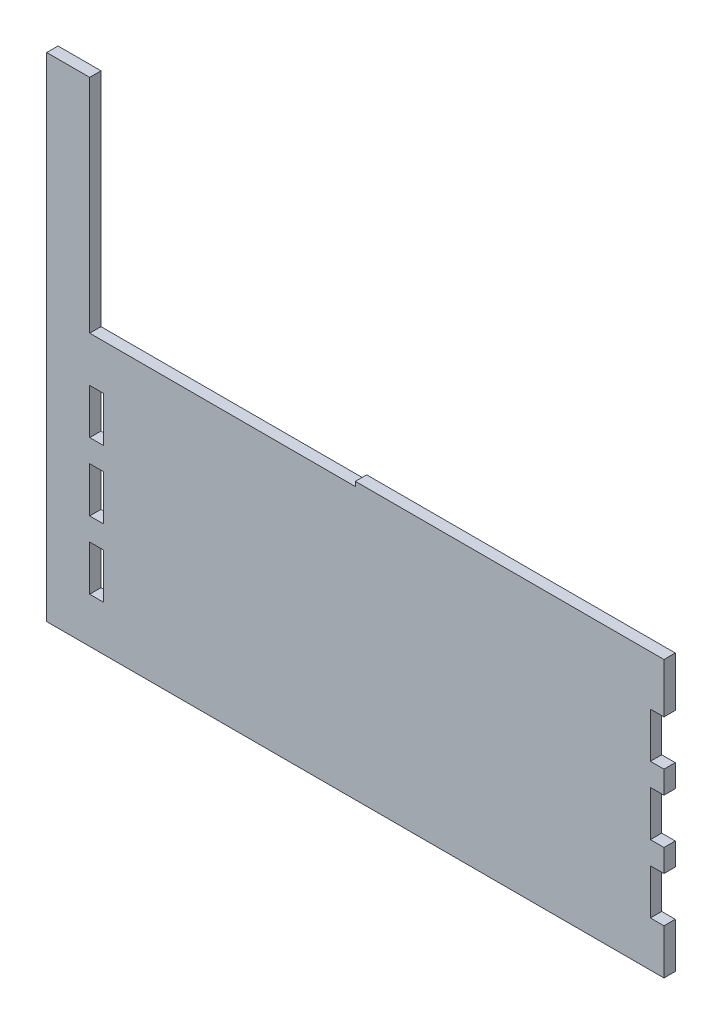
ISO-10303-21;
HEADER;
FILE_DESCRIPTION(('STEP AP214'),'2;1');
FILE_NAME('part.step','',(''),(''),'','','');
FILE_SCHEMA(('AUTOMOTIVE_DESIGN { 1 0 10303 214 1 1 1 1 }'));
ENDSEC;
DATA;
#1=APPLICATION_CONTEXT('core data for automotive mechanical design processes');
#2=APPLICATION_PROTOCOL_DEFINITION('international standard','automotive_design',2000,#1);
#3=PRODUCT_CONTEXT('',#1,'mechanical');
#4=PRODUCT('Part','Part','',(#3));
#5=PRODUCT_RELATED_PRODUCT_CATEGORY('part','',(#4));
#6=PRODUCT_DEFINITION_FORMATION('','',#4);
#7=PRODUCT_DEFINITION_CONTEXT('part definition',#1,'design');
#8=PRODUCT_DEFINITION('design','',#6,#7);
#9=PRODUCT_DEFINITION_SHAPE('','',#8);
#10=(LENGTH_UNIT() NAMED_UNIT(*) SI_UNIT(.MILLI.,.METRE.));
#11=(NAMED_UNIT(*) PLANE_ANGLE_UNIT() SI_UNIT($,.RADIAN.));
#12=(NAMED_UNIT(*) SI_UNIT($,.STERADIAN.) SOLID_ANGLE_UNIT());
#13=UNCERTAINTY_MEASURE_WITH_UNIT(LENGTH_MEASURE(1.E-05),#10,'distance_accuracy_value','');
#14=(GEOMETRIC_REPRESENTATION_CONTEXT(3) GLOBAL_UNCERTAINTY_ASSIGNED_CONTEXT((#13)) GLOBAL_UNIT_ASSIGNED_CONTEXT((#10,
#11,#12)) REPRESENTATION_CONTEXT('',''));
#15=CARTESIAN_POINT('',(0.,0.,0.));
#16=DIRECTION('',(0.,0.,1.));
#17=DIRECTION('',(1.,0.,0.));
#18=AXIS2_PLACEMENT_3D('',#15,#16,#17);
#19=CARTESIAN_POINT('',(0.,0.,5.));
#20=DIRECTION('',(0.,0.,-1.));
#21=DIRECTION('',(-1.,0.,0.));
#22=AXIS2_PLACEMENT_3D('',#19,#20,#21);
#23=PLANE('',#22);
#24=DIRECTION('',(0.,-1.,0.));
#25=VECTOR('',#24,1.);
#26=CARTESIAN_POINT('',(-111.5,0.,5.));
#27=LINE('',#26,#25);
#28=CARTESIAN_POINT('',(-111.5,39.,5.));
#29=VERTEX_POINT('',#28);
#30=CARTESIAN_POINT('',(-111.5,19.,5.));
#31=VERTEX_POINT('',#30);
#32=EDGE_CURVE('E405',#29,#31,#27,.T.);
#33=ORIENTED_EDGE('',*,*,#32,.T.);
#34=DIRECTION('',(1.,0.,0.));
#35=VECTOR('',#34,1.);
#36=CARTESIAN_POINT('',(0.,19.,5.));
#37=LINE('',#36,#35);
#38=CARTESIAN_POINT('',(-117.5,19.,5.));
#39=VERTEX_POINT('',#38);
#40=EDGE_CURVE('E511',#39,#31,#37,.T.);
#41=ORIENTED_EDGE('',*,*,#40,.F.);
#42=DIRECTION('',(0.,-1.,0.));
#43=VECTOR('',#42,1.);
#44=CARTESIAN_POINT('',(-117.5,0.,5.));
#45=LINE('',#44,#43);
#46=CARTESIAN_POINT('',(-117.5,39.,5.));
#47=VERTEX_POINT('',#46);
#48=EDGE_CURVE('E507',#47,#39,#45,.T.);
#49=ORIENTED_EDGE('',*,*,#48,.F.);
#50=DIRECTION('',(1.,0.,0.));
#51=VECTOR('',#50,1.);
#52=CARTESIAN_POINT('',(0.,39.,5.));
#53=LINE('',#52,#51);
#54=EDGE_CURVE('E503',#47,#29,#53,.T.);
#55=ORIENTED_EDGE('',*,*,#54,.T.);
#56=EDGE_LOOP('',(#33,#41,#49,#55));
#57=FACE_BOUND('',#56,.T.);
#58=DIRECTION('',(0.,1.,0.));
#59=VECTOR('',#58,1.);
#60=CARTESIAN_POINT('',(-111.5,0.,5.));
#61=LINE('',#60,#59);
#62=CARTESIAN_POINT('',(-111.5,-41.,5.));
#63=VERTEX_POINT('',#62);
#64=CARTESIAN_POINT('',(-111.5,-21.,5.));
#65=VERTEX_POINT('',#64);
#66=EDGE_CURVE('E428',#63,#65,#61,.T.);
#67=ORIENTED_EDGE('',*,*,#66,.F.);
#68=DIRECTION('',(1.,0.,0.));
#69=VECTOR('',#68,1.);
#70=CARTESIAN_POINT('',(0.,-41.,5.));
#71=LINE('',#70,#69);
#72=CARTESIAN_POINT('',(-117.5,-41.,5.));
#73=VERTEX_POINT('',#72);
#74=EDGE_CURVE('E62',#73,#63,#71,.T.);
#75=ORIENTED_EDGE('',*,*,#74,.F.);
#76=DIRECTION('',(0.,-1.,0.));
#77=VECTOR('',#76,1.);
#78=CARTESIAN_POINT('',(-117.5,0.,5.));
#79=LINE('',#78,#77);
#80=CARTESIAN_POINT('',(-117.5,-21.,5.));
#81=VERTEX_POINT('',#80);
#82=EDGE_CURVE('E437',#81,#73,#79,.T.);
#83=ORIENTED_EDGE('',*,*,#82,.F.);
#84=DIRECTION('',(1.,0.,0.));
#85=VECTOR('',#84,1.);
#86=CARTESIAN_POINT('',(0.,-21.,5.));
#87=LINE('',#86,#85);
#88=EDGE_CURVE('E433',#81,#65,#87,.T.);
#89=ORIENTED_EDGE('',*,*,#88,.T.);
#90=EDGE_LOOP('',(#67,#75,#83,#89));
#91=FACE_BOUND('',#90,.T.);
#92=DIRECTION('',(0.,1.,0.));
#93=VECTOR('',#92,1.);
#94=CARTESIAN_POINT('',(-111.5,0.,5.));
#95=LINE('',#94,#93);
#96=CARTESIAN_POINT('',(-111.5,-11.,5.));
#97=VERTEX_POINT('',#96);
#98=CARTESIAN_POINT('',(-111.5,9.,5.));
#99=VERTEX_POINT('',#98);
#100=EDGE_CURVE('E589',#97,#99,#95,.T.);
#101=ORIENTED_EDGE('',*,*,#100,.F.);
#102=DIRECTION('',(1.,0.,0.));
#103=VECTOR('',#102,1.);
#104=CARTESIAN_POINT('',(0.,-11.,5.));
#105=LINE('',#104,#103);
#106=CARTESIAN_POINT('',(-117.5,-11.,5.));
#107=VERTEX_POINT('',#106);
#108=EDGE_CURVE('E54',#107,#97,#105,.T.);
#109=ORIENTED_EDGE('',*,*,#108,.F.);
#110=DIRECTION('',(0.,-1.,0.));
#111=VECTOR('',#110,1.);
#112=CARTESIAN_POINT('',(-117.5,0.,5.));
#113=LINE('',#112,#111);
#114=CARTESIAN_POINT('',(-117.5,9.,5.));
#115=VERTEX_POINT('',#114);
#116=EDGE_CURVE('E403',#115,#107,#113,.T.);
#117=ORIENTED_EDGE('',*,*,#116,.F.);
#118=DIRECTION('',(1.,0.,0.));
#119=VECTOR('',#118,1.);
#120=CARTESIAN_POINT('',(0.,8.99999999999996,5.));
#121=LINE('',#120,#119);
#122=EDGE_CURVE('E417',#115,#99,#121,.T.);
#123=ORIENTED_EDGE('',*,*,#122,.T.);
#124=EDGE_LOOP('',(#101,#109,#117,#123));
#125=FACE_BOUND('',#124,.T.);
#126=DIRECTION('',(0.,-1.,0.));
#127=VECTOR('',#126,1.);
#128=CARTESIAN_POINT('',(0.,0.,5.));
#129=LINE('',#128,#127);
#130=CARTESIAN_POINT('',(0.,61.,5.));
#131=VERTEX_POINT('',#130);
#132=CARTESIAN_POINT('',(0.,59.,5.));
#133=VERTEX_POINT('',#132);
#134=EDGE_CURVE('E249',#131,#133,#129,.T.);
#135=ORIENTED_EDGE('',*,*,#134,.T.);
#136=DIRECTION('',(1.,0.,0.));
#137=VECTOR('',#136,1.);
#138=CARTESIAN_POINT('',(0.,59.,5.));
#139=LINE('',#138,#137);
#140=CARTESIAN_POINT('',(-117.5,59.,5.));
#141=VERTEX_POINT('',#140);
#142=EDGE_CURVE('E261',#141,#133,#139,.T.);
#143=ORIENTED_EDGE('',*,*,#142,.F.);
#144=DIRECTION('',(0.,1.,0.));
#145=VECTOR('',#144,1.);
#146=CARTESIAN_POINT('',(-117.5,61.,5.));
#147=LINE('',#146,#145);
#148=CARTESIAN_POINT('',(-117.5,157.,5.));
#149=VERTEX_POINT('',#148);
#150=EDGE_CURVE('E519',#141,#149,#147,.T.);
#151=ORIENTED_EDGE('',*,*,#150,.T.);
#152=DIRECTION('',(-1.,0.,0.));
#153=VECTOR('',#152,1.);
#154=CARTESIAN_POINT('',(-136.5,157.,5.));
#155=LINE('',#154,#153);
#156=CARTESIAN_POINT('',(-136.5,157.,5.));
#157=VERTEX_POINT('',#156);
#158=EDGE_CURVE('E534',#149,#157,#155,.T.);
#159=ORIENTED_EDGE('',*,*,#158,.T.);
#160=DIRECTION('',(0.,-1.,0.));
#161=VECTOR('',#160,1.);
#162=CARTESIAN_POINT('',(-136.5,-61.,5.));
#163=LINE('',#162,#161);
#164=CARTESIAN_POINT('',(-136.5,-61.,5.));
#165=VERTEX_POINT('',#164);
#166=EDGE_CURVE('E279',#157,#165,#163,.T.);
#167=ORIENTED_EDGE('',*,*,#166,.T.);
#168=DIRECTION('',(1.,0.,0.));
#169=VECTOR('',#168,1.);
#170=CARTESIAN_POINT('',(-136.5,-61.,5.));
#171=LINE('',#170,#169);
#172=CARTESIAN_POINT('',(136.5,-61.,5.));
#173=VERTEX_POINT('',#172);
#174=EDGE_CURVE('E284',#165,#173,#171,.T.);
#175=ORIENTED_EDGE('',*,*,#174,.T.);
#176=DIRECTION('',(0.,1.,0.));
#177=VECTOR('',#176,1.);
#178=CARTESIAN_POINT('',(136.5,-61.,5.));
#179=LINE('',#178,#177);
#180=CARTESIAN_POINT('',(136.5,-41.,5.));
#181=VERTEX_POINT('',#180);
#182=EDGE_CURVE('E280',#173,#181,#179,.T.);
#183=ORIENTED_EDGE('',*,*,#182,.T.);
#184=DIRECTION('',(1.,0.,0.));
#185=VECTOR('',#184,1.);
#186=CARTESIAN_POINT('',(0.,-41.,5.));
#187=LINE('',#186,#185);
#188=CARTESIAN_POINT('',(130.5,-41.,5.));
#189=VERTEX_POINT('',#188);
#190=EDGE_CURVE('E586',#189,#181,#187,.T.);
#191=ORIENTED_EDGE('',*,*,#190,.F.);
#192=DIRECTION('',(0.,1.,0.));
#193=VECTOR('',#192,1.);
#194=CARTESIAN_POINT('',(130.5,0.,5.));
#195=LINE('',#194,#193);
#196=CARTESIAN_POINT('',(130.5,-21.,5.));
#197=VERTEX_POINT('',#196);
#198=EDGE_CURVE('E667',#189,#197,#195,.T.);
#199=ORIENTED_EDGE('',*,*,#198,.T.);
#200=DIRECTION('',(1.,0.,0.));
#201=VECTOR('',#200,1.);
#202=CARTESIAN_POINT('',(0.,-21.,5.));
#203=LINE('',#202,#201);
#204=CARTESIAN_POINT('',(136.5,-21.,5.));
#205=VERTEX_POINT('',#204);
#206=EDGE_CURVE('E662',#197,#205,#203,.T.);
#207=ORIENTED_EDGE('',*,*,#206,.T.);
#208=CARTESIAN_POINT('',(136.5,-11.,5.));
#209=VERTEX_POINT('',#208);
#210=EDGE_CURVE('E287',#205,#209,#179,.T.);
#211=ORIENTED_EDGE('',*,*,#210,.T.);
#212=DIRECTION('',(1.,0.,0.));
#213=VECTOR('',#212,1.);
#214=CARTESIAN_POINT('',(0.,-11.,5.));
#215=LINE('',#214,#213);
#216=CARTESIAN_POINT('',(130.5,-11.,5.));
#217=VERTEX_POINT('',#216);
#218=EDGE_CURVE('E485',#217,#209,#215,.T.);
#219=ORIENTED_EDGE('',*,*,#218,.F.);
#220=DIRECTION('',(0.,1.,0.));
#221=VECTOR('',#220,1.);
#222=CARTESIAN_POINT('',(130.5,0.,5.));
#223=LINE('',#222,#221);
#224=CARTESIAN_POINT('',(130.5,9.,5.));
#225=VERTEX_POINT('',#224);
#226=EDGE_CURVE('E480',#217,#225,#223,.T.);
#227=ORIENTED_EDGE('',*,*,#226,.T.);
#228=DIRECTION('',(1.,0.,0.));
#229=VECTOR('',#228,1.);
#230=CARTESIAN_POINT('',(0.,9.,5.));
#231=LINE('',#230,#229);
#232=CARTESIAN_POINT('',(136.5,9.,5.));
#233=VERTEX_POINT('',#232);
#234=EDGE_CURVE('E476',#225,#233,#231,.T.);
#235=ORIENTED_EDGE('',*,*,#234,.T.);
#236=CARTESIAN_POINT('',(136.5,19.,5.));
#237=VERTEX_POINT('',#236);
#238=EDGE_CURVE('E980',#233,#237,#179,.T.);
#239=ORIENTED_EDGE('',*,*,#238,.T.);
#240=DIRECTION('',(1.,0.,0.));
#241=VECTOR('',#240,1.);
#242=CARTESIAN_POINT('',(0.,19.,5.));
#243=LINE('',#242,#241);
#244=CARTESIAN_POINT('',(130.5,19.,5.));
#245=VERTEX_POINT('',#244);
#246=EDGE_CURVE('E457',#245,#237,#243,.T.);
#247=ORIENTED_EDGE('',*,*,#246,.F.);
#248=DIRECTION('',(0.,-1.,0.));
#249=VECTOR('',#248,1.);
#250=CARTESIAN_POINT('',(130.5,0.,5.));
#251=LINE('',#250,#249);
#252=CARTESIAN_POINT('',(130.5,39.,5.));
#253=VERTEX_POINT('',#252);
#254=EDGE_CURVE('E453',#253,#245,#251,.T.);
#255=ORIENTED_EDGE('',*,*,#254,.F.);
#256=DIRECTION('',(1.,0.,0.));
#257=VECTOR('',#256,1.);
#258=CARTESIAN_POINT('',(0.,39.0000000000001,5.));
#259=LINE('',#258,#257);
#260=CARTESIAN_POINT('',(136.5,39.,5.));
#261=VERTEX_POINT('',#260);
#262=EDGE_CURVE('E461',#253,#261,#259,.T.);
#263=ORIENTED_EDGE('',*,*,#262,.T.);
#264=CARTESIAN_POINT('',(136.5,61.,5.));
#265=VERTEX_POINT('',#264);
#266=EDGE_CURVE('E277',#261,#265,#179,.T.);
#267=ORIENTED_EDGE('',*,*,#266,.T.);
#268=DIRECTION('',(-1.,0.,0.));
#269=VECTOR('',#268,1.);
#270=CARTESIAN_POINT('',(-136.5,61.,5.));
#271=LINE('',#270,#269);
#272=EDGE_CURVE('E268',#265,#131,#271,.T.);
#273=ORIENTED_EDGE('',*,*,#272,.T.);
#274=EDGE_LOOP('',(#135,#143,#151,#159,#167,#175,#183,#191,#199,#207,#211,#219,#227,#235,#239,
#247,#255,#263,#267,#273));
#275=FACE_BOUND('',#274,.T.);
#276=ADVANCED_FACE('F38',(#57,#91,#125,#275),#23,.F.);
#277=CARTESIAN_POINT('',(0.,0.,0.));
#278=DIRECTION('',(0.,0.,-1.));
#279=DIRECTION('',(-1.,0.,0.));
#280=AXIS2_PLACEMENT_3D('',#277,#278,#279);
#281=PLANE('',#280);
#282=DIRECTION('',(-1.,0.,0.));
#283=VECTOR('',#282,1.);
#284=CARTESIAN_POINT('',(0.,-11.,0.));
#285=LINE('',#284,#283);
#286=CARTESIAN_POINT('',(-111.5,-11.,0.));
#287=VERTEX_POINT('',#286);
#288=CARTESIAN_POINT('',(-117.5,-11.,0.));
#289=VERTEX_POINT('',#288);
#290=EDGE_CURVE('E47',#287,#289,#285,.T.);
#291=ORIENTED_EDGE('',*,*,#290,.F.);
#292=DIRECTION('',(0.,-1.,0.));
#293=VECTOR('',#292,1.);
#294=CARTESIAN_POINT('',(-111.5,0.,0.));
#295=LINE('',#294,#293);
#296=CARTESIAN_POINT('',(-111.5,9.,0.));
#297=VERTEX_POINT('',#296);
#298=EDGE_CURVE('E380',#297,#287,#295,.T.);
#299=ORIENTED_EDGE('',*,*,#298,.F.);
#300=DIRECTION('',(-1.,0.,0.));
#301=VECTOR('',#300,1.);
#302=CARTESIAN_POINT('',(0.,8.99999999999996,0.));
#303=LINE('',#302,#301);
#304=CARTESIAN_POINT('',(-117.5,9.,0.));
#305=VERTEX_POINT('',#304);
#306=EDGE_CURVE('E383',#297,#305,#303,.T.);
#307=ORIENTED_EDGE('',*,*,#306,.T.);
#308=DIRECTION('',(0.,1.,0.));
#309=VECTOR('',#308,1.);
#310=CARTESIAN_POINT('',(-117.5,0.,0.));
#311=LINE('',#310,#309);
#312=EDGE_CURVE('E387',#289,#305,#311,.T.);
#313=ORIENTED_EDGE('',*,*,#312,.F.);
#314=EDGE_LOOP('',(#291,#299,#307,#313));
#315=FACE_BOUND('',#314,.T.);
#316=DIRECTION('',(-1.,0.,0.));
#317=VECTOR('',#316,1.);
#318=CARTESIAN_POINT('',(0.,-41.,0.));
#319=LINE('',#318,#317);
#320=CARTESIAN_POINT('',(-111.5,-41.,0.));
#321=VERTEX_POINT('',#320);
#322=CARTESIAN_POINT('',(-117.5,-41.,0.));
#323=VERTEX_POINT('',#322);
#324=EDGE_CURVE('E377',#321,#323,#319,.T.);
#325=ORIENTED_EDGE('',*,*,#324,.F.);
#326=DIRECTION('',(0.,-1.,0.));
#327=VECTOR('',#326,1.);
#328=CARTESIAN_POINT('',(-111.5,0.,0.));
#329=LINE('',#328,#327);
#330=CARTESIAN_POINT('',(-111.5,-21.,0.));
#331=VERTEX_POINT('',#330);
#332=EDGE_CURVE('E367',#331,#321,#329,.T.);
#333=ORIENTED_EDGE('',*,*,#332,.F.);
#334=DIRECTION('',(-1.,0.,0.));
#335=VECTOR('',#334,1.);
#336=CARTESIAN_POINT('',(0.,-21.,0.));
#337=LINE('',#336,#335);
#338=CARTESIAN_POINT('',(-117.5,-21.,0.));
#339=VERTEX_POINT('',#338);
#340=EDGE_CURVE('E370',#331,#339,#337,.T.);
#341=ORIENTED_EDGE('',*,*,#340,.T.);
#342=DIRECTION('',(0.,1.,0.));
#343=VECTOR('',#342,1.);
#344=CARTESIAN_POINT('',(-117.5,0.,0.));
#345=LINE('',#344,#343);
#346=EDGE_CURVE('E374',#323,#339,#345,.T.);
#347=ORIENTED_EDGE('',*,*,#346,.F.);
#348=EDGE_LOOP('',(#325,#333,#341,#347));
#349=FACE_BOUND('',#348,.T.);
#350=DIRECTION('',(-1.,0.,0.));
#351=VECTOR('',#350,1.);
#352=CARTESIAN_POINT('',(0.,19.,0.));
#353=LINE('',#352,#351);
#354=CARTESIAN_POINT('',(-111.5,19.,0.));
#355=VERTEX_POINT('',#354);
#356=CARTESIAN_POINT('',(-117.5,19.,0.));
#357=VERTEX_POINT('',#356);
#358=EDGE_CURVE('E326',#355,#357,#353,.T.);
#359=ORIENTED_EDGE('',*,*,#358,.F.);
#360=DIRECTION('',(0.,1.,0.));
#361=VECTOR('',#360,1.);
#362=CARTESIAN_POINT('',(-111.5,0.,0.));
#363=LINE('',#362,#361);
#364=CARTESIAN_POINT('',(-111.5,39.,0.));
#365=VERTEX_POINT('',#364);
#366=EDGE_CURVE('E329',#355,#365,#363,.T.);
#367=ORIENTED_EDGE('',*,*,#366,.T.);
#368=DIRECTION('',(-1.,0.,0.));
#369=VECTOR('',#368,1.);
#370=CARTESIAN_POINT('',(0.,39.,0.));
#371=LINE('',#370,#369);
#372=CARTESIAN_POINT('',(-117.5,39.,0.));
#373=VERTEX_POINT('',#372);
#374=EDGE_CURVE('E318',#365,#373,#371,.T.);
#375=ORIENTED_EDGE('',*,*,#374,.T.);
#376=DIRECTION('',(0.,1.,0.));
#377=VECTOR('',#376,1.);
#378=CARTESIAN_POINT('',(-117.5,0.,0.));
#379=LINE('',#378,#377);
#380=EDGE_CURVE('E322',#357,#373,#379,.T.);
#381=ORIENTED_EDGE('',*,*,#380,.F.);
#382=EDGE_LOOP('',(#359,#367,#375,#381));
#383=FACE_BOUND('',#382,.T.);
#384=DIRECTION('',(-1.,0.,0.));
#385=VECTOR('',#384,1.);
#386=CARTESIAN_POINT('',(0.,59.,0.));
#387=LINE('',#386,#385);
#388=CARTESIAN_POINT('',(0.,59.,0.));
#389=VERTEX_POINT('',#388);
#390=CARTESIAN_POINT('',(-117.5,59.,0.));
#391=VERTEX_POINT('',#390);
#392=EDGE_CURVE('E11',#389,#391,#387,.T.);
#393=ORIENTED_EDGE('',*,*,#392,.F.);
#394=DIRECTION('',(0.,1.,0.));
#395=VECTOR('',#394,1.);
#396=CARTESIAN_POINT('',(0.,0.,0.));
#397=LINE('',#396,#395);
#398=CARTESIAN_POINT('',(0.,61.,0.));
#399=VERTEX_POINT('',#398);
#400=EDGE_CURVE('E660',#389,#399,#397,.T.);
#401=ORIENTED_EDGE('',*,*,#400,.T.);
#402=DIRECTION('',(-1.,0.,0.));
#403=VECTOR('',#402,1.);
#404=CARTESIAN_POINT('',(-136.5,61.,0.));
#405=LINE('',#404,#403);
#406=CARTESIAN_POINT('',(136.5,61.,0.));
#407=VERTEX_POINT('',#406);
#408=EDGE_CURVE('E271',#407,#399,#405,.T.);
#409=ORIENTED_EDGE('',*,*,#408,.F.);
#410=DIRECTION('',(0.,1.,0.));
#411=VECTOR('',#410,1.);
#412=CARTESIAN_POINT('',(136.5,-61.,0.));
#413=LINE('',#412,#411);
#414=CARTESIAN_POINT('',(136.5,39.,0.));
#415=VERTEX_POINT('',#414);
#416=EDGE_CURVE('E299',#415,#407,#413,.T.);
#417=ORIENTED_EDGE('',*,*,#416,.F.);
#418=DIRECTION('',(-1.,0.,0.));
#419=VECTOR('',#418,1.);
#420=CARTESIAN_POINT('',(0.,39.0000000000001,0.));
#421=LINE('',#420,#419);
#422=CARTESIAN_POINT('',(130.5,39.,0.));
#423=VERTEX_POINT('',#422);
#424=EDGE_CURVE('E363',#415,#423,#421,.T.);
#425=ORIENTED_EDGE('',*,*,#424,.T.);
#426=DIRECTION('',(0.,1.,0.));
#427=VECTOR('',#426,1.);
#428=CARTESIAN_POINT('',(130.5,0.,0.));
#429=LINE('',#428,#427);
#430=CARTESIAN_POINT('',(130.5,19.,0.));
#431=VERTEX_POINT('',#430);
#432=EDGE_CURVE('E360',#431,#423,#429,.T.);
#433=ORIENTED_EDGE('',*,*,#432,.F.);
#434=DIRECTION('',(-1.,0.,0.));
#435=VECTOR('',#434,1.);
#436=CARTESIAN_POINT('',(0.,19.,0.));
#437=LINE('',#436,#435);
#438=CARTESIAN_POINT('',(136.5,19.,0.));
#439=VERTEX_POINT('',#438);
#440=EDGE_CURVE('E357',#439,#431,#437,.T.);
#441=ORIENTED_EDGE('',*,*,#440,.F.);
#442=CARTESIAN_POINT('',(136.5,9.,0.));
#443=VERTEX_POINT('',#442);
#444=EDGE_CURVE('E652',#443,#439,#413,.T.);
#445=ORIENTED_EDGE('',*,*,#444,.F.);
#446=DIRECTION('',(-1.,0.,0.));
#447=VECTOR('',#446,1.);
#448=CARTESIAN_POINT('',(0.,9.,0.));
#449=LINE('',#448,#447);
#450=CARTESIAN_POINT('',(130.5,9.,0.));
#451=VERTEX_POINT('',#450);
#452=EDGE_CURVE('E353',#443,#451,#449,.T.);
#453=ORIENTED_EDGE('',*,*,#452,.T.);
#454=DIRECTION('',(0.,-1.,0.));
#455=VECTOR('',#454,1.);
#456=CARTESIAN_POINT('',(130.5,0.,0.));
#457=LINE('',#456,#455);
#458=CARTESIAN_POINT('',(130.5,-11.,0.));
#459=VERTEX_POINT('',#458);
#460=EDGE_CURVE('E345',#451,#459,#457,.T.);
#461=ORIENTED_EDGE('',*,*,#460,.T.);
#462=DIRECTION('',(-1.,0.,0.));
#463=VECTOR('',#462,1.);
#464=CARTESIAN_POINT('',(0.,-11.,0.));
#465=LINE('',#464,#463);
#466=CARTESIAN_POINT('',(136.5,-11.,0.));
#467=VERTEX_POINT('',#466);
#468=EDGE_CURVE('E349',#467,#459,#465,.T.);
#469=ORIENTED_EDGE('',*,*,#468,.F.);
#470=CARTESIAN_POINT('',(136.5,-21.,0.));
#471=VERTEX_POINT('',#470);
#472=EDGE_CURVE('E298',#471,#467,#413,.T.);
#473=ORIENTED_EDGE('',*,*,#472,.F.);
#474=DIRECTION('',(-1.,0.,0.));
#475=VECTOR('',#474,1.);
#476=CARTESIAN_POINT('',(0.,-21.,0.));
#477=LINE('',#476,#475);
#478=CARTESIAN_POINT('',(130.5,-21.,0.));
#479=VERTEX_POINT('',#478);
#480=EDGE_CURVE('E341',#471,#479,#477,.T.);
#481=ORIENTED_EDGE('',*,*,#480,.T.);
#482=DIRECTION('',(0.,-1.,0.));
#483=VECTOR('',#482,1.);
#484=CARTESIAN_POINT('',(130.5,0.,0.));
#485=LINE('',#484,#483);
#486=CARTESIAN_POINT('',(130.5,-41.,0.));
#487=VERTEX_POINT('',#486);
#488=EDGE_CURVE('E333',#479,#487,#485,.T.);
#489=ORIENTED_EDGE('',*,*,#488,.T.);
#490=DIRECTION('',(-1.,0.,0.));
#491=VECTOR('',#490,1.);
#492=CARTESIAN_POINT('',(0.,-41.,0.));
#493=LINE('',#492,#491);
#494=CARTESIAN_POINT('',(136.5,-41.,0.));
#495=VERTEX_POINT('',#494);
#496=EDGE_CURVE('E337',#495,#487,#493,.T.);
#497=ORIENTED_EDGE('',*,*,#496,.F.);
#498=CARTESIAN_POINT('',(136.5,-61.,0.));
#499=VERTEX_POINT('',#498);
#500=EDGE_CURVE('E294',#499,#495,#413,.T.);
#501=ORIENTED_EDGE('',*,*,#500,.F.);
#502=DIRECTION('',(1.,0.,0.));
#503=VECTOR('',#502,1.);
#504=CARTESIAN_POINT('',(-136.5,-61.,0.));
#505=LINE('',#504,#503);
#506=CARTESIAN_POINT('',(-136.5,-61.,0.));
#507=VERTEX_POINT('',#506);
#508=EDGE_CURVE('E305',#507,#499,#505,.T.);
#509=ORIENTED_EDGE('',*,*,#508,.F.);
#510=DIRECTION('',(0.,-1.,0.));
#511=VECTOR('',#510,1.);
#512=CARTESIAN_POINT('',(-136.5,-61.,0.));
#513=LINE('',#512,#511);
#514=CARTESIAN_POINT('',(-136.5,157.,0.));
#515=VERTEX_POINT('',#514);
#516=EDGE_CURVE('E302',#515,#507,#513,.T.);
#517=ORIENTED_EDGE('',*,*,#516,.F.);
#518=DIRECTION('',(-1.,0.,0.));
#519=VECTOR('',#518,1.);
#520=CARTESIAN_POINT('',(-136.5,157.,0.));
#521=LINE('',#520,#519);
#522=CARTESIAN_POINT('',(-117.5,157.,0.));
#523=VERTEX_POINT('',#522);
#524=EDGE_CURVE('E533',#523,#515,#521,.T.);
#525=ORIENTED_EDGE('',*,*,#524,.F.);
#526=DIRECTION('',(0.,1.,0.));
#527=VECTOR('',#526,1.);
#528=CARTESIAN_POINT('',(-117.5,61.,0.));
#529=LINE('',#528,#527);
#530=EDGE_CURVE('E529',#391,#523,#529,.T.);
#531=ORIENTED_EDGE('',*,*,#530,.F.);
#532=EDGE_LOOP('',(#393,#401,#409,#417,#425,#433,#441,#445,#453,#461,#469,#473,#481,#489,#497,
#501,#509,#517,#525,#531));
#533=FACE_BOUND('',#532,.T.);
#534=ADVANCED_FACE('F408',(#315,#349,#383,#533),#281,.T.);
#535=CARTESIAN_POINT('',(-136.5,61.,5.));
#536=DIRECTION('',(0.,-1.,0.));
#537=DIRECTION('',(0.,0.,-1.));
#538=AXIS2_PLACEMENT_3D('',#535,#536,#537);
#539=PLANE('',#538);
#540=DIRECTION('',(0.,0.,1.));
#541=VECTOR('',#540,1.);
#542=CARTESIAN_POINT('',(0.,61.,-1.));
#543=LINE('',#542,#541);
#544=EDGE_CURVE('E252',#399,#131,#543,.T.);
#545=ORIENTED_EDGE('',*,*,#544,.T.);
#546=ORIENTED_EDGE('',*,*,#272,.F.);
#547=DIRECTION('',(0.,0.,-1.));
#548=VECTOR('',#547,1.);
#549=CARTESIAN_POINT('',(136.5,61.,5.));
#550=LINE('',#549,#548);
#551=EDGE_CURVE('E315',#265,#407,#550,.T.);
#552=ORIENTED_EDGE('',*,*,#551,.T.);
#553=ORIENTED_EDGE('',*,*,#408,.T.);
#554=EDGE_LOOP('',(#545,#546,#552,#553));
#555=FACE_BOUND('',#554,.T.);
#556=ADVANCED_FACE('F266',(#555),#539,.F.);
#557=CARTESIAN_POINT('',(136.5,-61.,5.));
#558=DIRECTION('',(-1.,0.,0.));
#559=DIRECTION('',(0.,0.,1.));
#560=AXIS2_PLACEMENT_3D('',#557,#558,#559);
#561=PLANE('',#560);
#562=DIRECTION('',(0.,0.,1.));
#563=VECTOR('',#562,1.);
#564=CARTESIAN_POINT('',(136.5,39.,-1.));
#565=LINE('',#564,#563);
#566=EDGE_CURVE('E467',#415,#261,#565,.T.);
#567=ORIENTED_EDGE('',*,*,#566,.F.);
#568=ORIENTED_EDGE('',*,*,#416,.T.);
#569=ORIENTED_EDGE('',*,*,#551,.F.);
#570=ORIENTED_EDGE('',*,*,#266,.F.);
#571=EDGE_LOOP('',(#567,#568,#569,#570));
#572=FACE_BOUND('',#571,.T.);
#573=ADVANCED_FACE('F624',(#572),#561,.F.);
#574=ORIENTED_EDGE('',*,*,#444,.T.);
#575=DIRECTION('',(0.,0.,1.));
#576=VECTOR('',#575,1.);
#577=CARTESIAN_POINT('',(136.5,19.,-1.));
#578=LINE('',#577,#576);
#579=EDGE_CURVE('E470',#439,#237,#578,.T.);
#580=ORIENTED_EDGE('',*,*,#579,.T.);
#581=ORIENTED_EDGE('',*,*,#238,.F.);
#582=DIRECTION('',(0.,0.,1.));
#583=VECTOR('',#582,1.);
#584=CARTESIAN_POINT('',(136.5,9.,-1.));
#585=LINE('',#584,#583);
#586=EDGE_CURVE('E458',#443,#233,#585,.T.);
#587=ORIENTED_EDGE('',*,*,#586,.F.);
#588=EDGE_LOOP('',(#574,#580,#581,#587));
#589=FACE_BOUND('',#588,.T.);
#590=ADVANCED_FACE('F629',(#589),#561,.F.);
#591=ORIENTED_EDGE('',*,*,#472,.T.);
#592=DIRECTION('',(0.,0.,1.));
#593=VECTOR('',#592,1.);
#594=CARTESIAN_POINT('',(136.5,-11.,-1.));
#595=LINE('',#594,#593);
#596=EDGE_CURVE('E491',#467,#209,#595,.T.);
#597=ORIENTED_EDGE('',*,*,#596,.T.);
#598=ORIENTED_EDGE('',*,*,#210,.F.);
#599=DIRECTION('',(0.,0.,1.));
#600=VECTOR('',#599,1.);
#601=CARTESIAN_POINT('',(136.5,-21.,-1.));
#602=LINE('',#601,#600);
#603=EDGE_CURVE('E481',#471,#205,#602,.T.);
#604=ORIENTED_EDGE('',*,*,#603,.F.);
#605=EDGE_LOOP('',(#591,#597,#598,#604));
#606=FACE_BOUND('',#605,.T.);
#607=ADVANCED_FACE('F634',(#606),#561,.F.);
#608=ORIENTED_EDGE('',*,*,#500,.T.);
#609=DIRECTION('',(0.,0.,1.));
#610=VECTOR('',#609,1.);
#611=CARTESIAN_POINT('',(136.5,-41.,-1.));
#612=LINE('',#611,#610);
#613=EDGE_CURVE('E571',#495,#181,#612,.T.);
#614=ORIENTED_EDGE('',*,*,#613,.T.);
#615=ORIENTED_EDGE('',*,*,#182,.F.);
#616=DIRECTION('',(0.,0.,-1.));
#617=VECTOR('',#616,1.);
#618=CARTESIAN_POINT('',(136.5,-61.,5.));
#619=LINE('',#618,#617);
#620=EDGE_CURVE('E293',#173,#499,#619,.T.);
#621=ORIENTED_EDGE('',*,*,#620,.T.);
#622=EDGE_LOOP('',(#608,#614,#615,#621));
#623=FACE_BOUND('',#622,.T.);
#624=ADVANCED_FACE('F40',(#623),#561,.F.);
#625=CARTESIAN_POINT('',(-136.5,-61.,5.));
#626=DIRECTION('',(1.,0.,0.));
#627=DIRECTION('',(0.,0.,-1.));
#628=AXIS2_PLACEMENT_3D('',#625,#626,#627);
#629=PLANE('',#628);
#630=ORIENTED_EDGE('',*,*,#516,.T.);
#631=DIRECTION('',(0.,0.,-1.));
#632=VECTOR('',#631,1.);
#633=CARTESIAN_POINT('',(-136.5,-61.,5.));
#634=LINE('',#633,#632);
#635=EDGE_CURVE('E311',#165,#507,#634,.T.);
#636=ORIENTED_EDGE('',*,*,#635,.F.);
#637=ORIENTED_EDGE('',*,*,#166,.F.);
#638=DIRECTION('',(0.,0.,1.));
#639=VECTOR('',#638,1.);
#640=CARTESIAN_POINT('',(-136.5,157.,0.));
#641=LINE('',#640,#639);
#642=EDGE_CURVE('E545',#515,#157,#641,.T.);
#643=ORIENTED_EDGE('',*,*,#642,.F.);
#644=EDGE_LOOP('',(#630,#636,#637,#643));
#645=FACE_BOUND('',#644,.T.);
#646=ADVANCED_FACE('F559',(#645),#629,.F.);
#647=CARTESIAN_POINT('',(-136.5,-61.,5.));
#648=DIRECTION('',(0.,1.,0.));
#649=DIRECTION('',(0.,0.,1.));
#650=AXIS2_PLACEMENT_3D('',#647,#648,#649);
#651=PLANE('',#650);
#652=ORIENTED_EDGE('',*,*,#508,.T.);
#653=ORIENTED_EDGE('',*,*,#620,.F.);
#654=ORIENTED_EDGE('',*,*,#174,.F.);
#655=ORIENTED_EDGE('',*,*,#635,.T.);
#656=EDGE_LOOP('',(#652,#653,#654,#655));
#657=FACE_BOUND('',#656,.T.);
#658=ADVANCED_FACE('F566',(#657),#651,.F.);
#659=CARTESIAN_POINT('',(-136.5,157.,0.));
#660=DIRECTION('',(0.,1.,0.));
#661=DIRECTION('',(0.,0.,1.));
#662=AXIS2_PLACEMENT_3D('',#659,#660,#661);
#663=PLANE('',#662);
#664=ORIENTED_EDGE('',*,*,#158,.F.);
#665=DIRECTION('',(0.,0.,1.));
#666=VECTOR('',#665,1.);
#667=CARTESIAN_POINT('',(-117.5,157.,0.));
#668=LINE('',#667,#666);
#669=EDGE_CURVE('E538',#523,#149,#668,.T.);
#670=ORIENTED_EDGE('',*,*,#669,.F.);
#671=ORIENTED_EDGE('',*,*,#524,.T.);
#672=ORIENTED_EDGE('',*,*,#642,.T.);
#673=EDGE_LOOP('',(#664,#670,#671,#672));
#674=FACE_BOUND('',#673,.T.);
#675=ADVANCED_FACE('F556',(#674),#663,.T.);
#676=CARTESIAN_POINT('',(-117.5,61.,0.));
#677=DIRECTION('',(1.,0.,0.));
#678=DIRECTION('',(0.,0.,-1.));
#679=AXIS2_PLACEMENT_3D('',#676,#677,#678);
#680=PLANE('',#679);
#681=ORIENTED_EDGE('',*,*,#150,.F.);
#682=DIRECTION('',(0.,0.,1.));
#683=VECTOR('',#682,1.);
#684=CARTESIAN_POINT('',(-117.5,59.,-1.));
#685=LINE('',#684,#683);
#686=EDGE_CURVE('E273',#391,#141,#685,.T.);
#687=ORIENTED_EDGE('',*,*,#686,.F.);
#688=ORIENTED_EDGE('',*,*,#530,.T.);
#689=ORIENTED_EDGE('',*,*,#669,.T.);
#690=EDGE_LOOP('',(#681,#687,#688,#689));
#691=FACE_BOUND('',#690,.T.);
#692=ADVANCED_FACE('F550',(#691),#680,.T.);
#693=CARTESIAN_POINT('',(-111.5,0.,-1.));
#694=DIRECTION('',(-1.,0.,0.));
#695=DIRECTION('',(0.,-1.,0.));
#696=AXIS2_PLACEMENT_3D('',#693,#694,#695);
#697=PLANE('',#696);
#698=DIRECTION('',(0.,0.,1.));
#699=VECTOR('',#698,1.);
#700=CARTESIAN_POINT('',(-111.5,19.,-1.));
#701=LINE('',#700,#699);
#702=EDGE_CURVE('E516',#355,#31,#701,.T.);
#703=ORIENTED_EDGE('',*,*,#702,.T.);
#704=ORIENTED_EDGE('',*,*,#32,.F.);
#705=DIRECTION('',(0.,0.,1.));
#706=VECTOR('',#705,1.);
#707=CARTESIAN_POINT('',(-111.5,39.,-1.));
#708=LINE('',#707,#706);
#709=EDGE_CURVE('E515',#365,#29,#708,.T.);
#710=ORIENTED_EDGE('',*,*,#709,.F.);
#711=ORIENTED_EDGE('',*,*,#366,.F.);
#712=EDGE_LOOP('',(#703,#704,#710,#711));
#713=FACE_BOUND('',#712,.T.);
#714=ADVANCED_FACE('F749',(#713),#697,.T.);
#715=CARTESIAN_POINT('',(0.,19.,-1.));
#716=DIRECTION('',(0.,-1.,0.));
#717=DIRECTION('',(0.,0.,-1.));
#718=AXIS2_PLACEMENT_3D('',#715,#716,#717);
#719=PLANE('',#718);
#720=ORIENTED_EDGE('',*,*,#358,.T.);
#721=DIRECTION('',(0.,0.,1.));
#722=VECTOR('',#721,1.);
#723=CARTESIAN_POINT('',(-117.5,19.,-1.));
#724=LINE('',#723,#722);
#725=EDGE_CURVE('E520',#357,#39,#724,.T.);
#726=ORIENTED_EDGE('',*,*,#725,.T.);
#727=ORIENTED_EDGE('',*,*,#40,.T.);
#728=ORIENTED_EDGE('',*,*,#702,.F.);
#729=EDGE_LOOP('',(#720,#726,#727,#728));
#730=FACE_BOUND('',#729,.T.);
#731=ADVANCED_FACE('F745',(#730),#719,.F.);
#732=CARTESIAN_POINT('',(-117.5,0.,-1.));
#733=DIRECTION('',(-1.,0.,0.));
#734=DIRECTION('',(0.,0.,1.));
#735=AXIS2_PLACEMENT_3D('',#732,#733,#734);
#736=PLANE('',#735);
#737=ORIENTED_EDGE('',*,*,#380,.T.);
#738=DIRECTION('',(0.,0.,1.));
#739=VECTOR('',#738,1.);
#740=CARTESIAN_POINT('',(-117.5,39.,-1.));
#741=LINE('',#740,#739);
#742=EDGE_CURVE('E523',#373,#47,#741,.T.);
#743=ORIENTED_EDGE('',*,*,#742,.T.);
#744=ORIENTED_EDGE('',*,*,#48,.T.);
#745=ORIENTED_EDGE('',*,*,#725,.F.);
#746=EDGE_LOOP('',(#737,#743,#744,#745));
#747=FACE_BOUND('',#746,.T.);
#748=ADVANCED_FACE('F748',(#747),#736,.F.);
#749=CARTESIAN_POINT('',(0.,39.,-1.));
#750=DIRECTION('',(0.,-1.,0.));
#751=DIRECTION('',(0.,0.,-1.));
#752=AXIS2_PLACEMENT_3D('',#749,#750,#751);
#753=PLANE('',#752);
#754=ORIENTED_EDGE('',*,*,#709,.T.);
#755=ORIENTED_EDGE('',*,*,#54,.F.);
#756=ORIENTED_EDGE('',*,*,#742,.F.);
#757=ORIENTED_EDGE('',*,*,#374,.F.);
#758=EDGE_LOOP('',(#754,#755,#756,#757));
#759=FACE_BOUND('',#758,.T.);
#760=ADVANCED_FACE('F699',(#759),#753,.T.);
#761=CARTESIAN_POINT('',(0.,-21.,-1.));
#762=DIRECTION('',(0.,-1.,0.));
#763=DIRECTION('',(0.,0.,-1.));
#764=AXIS2_PLACEMENT_3D('',#761,#762,#763);
#765=PLANE('',#764);
#766=ORIENTED_EDGE('',*,*,#603,.T.);
#767=ORIENTED_EDGE('',*,*,#206,.F.);
#768=DIRECTION('',(0.,0.,1.));
#769=VECTOR('',#768,1.);
#770=CARTESIAN_POINT('',(130.5,-21.,-1.));
#771=LINE('',#770,#769);
#772=EDGE_CURVE('E580',#479,#197,#771,.T.);
#773=ORIENTED_EDGE('',*,*,#772,.F.);
#774=ORIENTED_EDGE('',*,*,#480,.F.);
#775=EDGE_LOOP('',(#766,#767,#773,#774));
#776=FACE_BOUND('',#775,.T.);
#777=ADVANCED_FACE('F682',(#776),#765,.T.);
#778=CARTESIAN_POINT('',(0.,-41.,-1.));
#779=DIRECTION('',(0.,-1.,0.));
#780=DIRECTION('',(0.,0.,-1.));
#781=AXIS2_PLACEMENT_3D('',#778,#779,#780);
#782=PLANE('',#781);
#783=ORIENTED_EDGE('',*,*,#496,.T.);
#784=DIRECTION('',(0.,0.,1.));
#785=VECTOR('',#784,1.);
#786=CARTESIAN_POINT('',(130.5,-41.,-1.));
#787=LINE('',#786,#785);
#788=EDGE_CURVE('E575',#487,#189,#787,.T.);
#789=ORIENTED_EDGE('',*,*,#788,.T.);
#790=ORIENTED_EDGE('',*,*,#190,.T.);
#791=ORIENTED_EDGE('',*,*,#613,.F.);
#792=EDGE_LOOP('',(#783,#789,#790,#791));
#793=FACE_BOUND('',#792,.T.);
#794=ADVANCED_FACE('F675',(#793),#782,.F.);
#795=CARTESIAN_POINT('',(130.5,0.,-1.));
#796=DIRECTION('',(1.,0.,0.));
#797=DIRECTION('',(0.,0.,-1.));
#798=AXIS2_PLACEMENT_3D('',#795,#796,#797);
#799=PLANE('',#798);
#800=ORIENTED_EDGE('',*,*,#772,.T.);
#801=ORIENTED_EDGE('',*,*,#198,.F.);
#802=ORIENTED_EDGE('',*,*,#788,.F.);
#803=ORIENTED_EDGE('',*,*,#488,.F.);
#804=EDGE_LOOP('',(#800,#801,#802,#803));
#805=FACE_BOUND('',#804,.T.);
#806=ADVANCED_FACE('F679',(#805),#799,.T.);
#807=CARTESIAN_POINT('',(0.,9.,-1.));
#808=DIRECTION('',(0.,-1.,0.));
#809=DIRECTION('',(0.,0.,-1.));
#810=AXIS2_PLACEMENT_3D('',#807,#808,#809);
#811=PLANE('',#810);
#812=ORIENTED_EDGE('',*,*,#586,.T.);
#813=ORIENTED_EDGE('',*,*,#234,.F.);
#814=DIRECTION('',(0.,0.,1.));
#815=VECTOR('',#814,1.);
#816=CARTESIAN_POINT('',(130.5,9.,-1.));
#817=LINE('',#816,#815);
#818=EDGE_CURVE('E488',#451,#225,#817,.T.);
#819=ORIENTED_EDGE('',*,*,#818,.F.);
#820=ORIENTED_EDGE('',*,*,#452,.F.);
#821=EDGE_LOOP('',(#812,#813,#819,#820));
#822=FACE_BOUND('',#821,.T.);
#823=ADVANCED_FACE('F696',(#822),#811,.T.);
#824=CARTESIAN_POINT('',(0.,-11.,-1.));
#825=DIRECTION('',(0.,-1.,0.));
#826=DIRECTION('',(0.,0.,-1.));
#827=AXIS2_PLACEMENT_3D('',#824,#825,#826);
#828=PLANE('',#827);
#829=ORIENTED_EDGE('',*,*,#468,.T.);
#830=DIRECTION('',(0.,0.,1.));
#831=VECTOR('',#830,1.);
#832=CARTESIAN_POINT('',(130.5,-11.,-1.));
#833=LINE('',#832,#831);
#834=EDGE_CURVE('E495',#459,#217,#833,.T.);
#835=ORIENTED_EDGE('',*,*,#834,.T.);
#836=ORIENTED_EDGE('',*,*,#218,.T.);
#837=ORIENTED_EDGE('',*,*,#596,.F.);
#838=EDGE_LOOP('',(#829,#835,#836,#837));
#839=FACE_BOUND('',#838,.T.);
#840=ADVANCED_FACE('F735',(#839),#828,.F.);
#841=CARTESIAN_POINT('',(130.5,0.,-1.));
#842=DIRECTION('',(1.,0.,0.));
#843=DIRECTION('',(0.,0.,-1.));
#844=AXIS2_PLACEMENT_3D('',#841,#842,#843);
#845=PLANE('',#844);
#846=ORIENTED_EDGE('',*,*,#818,.T.);
#847=ORIENTED_EDGE('',*,*,#226,.F.);
#848=ORIENTED_EDGE('',*,*,#834,.F.);
#849=ORIENTED_EDGE('',*,*,#460,.F.);
#850=EDGE_LOOP('',(#846,#847,#848,#849));
#851=FACE_BOUND('',#850,.T.);
#852=ADVANCED_FACE('F733',(#851),#845,.T.);
#853=CARTESIAN_POINT('',(130.5,0.,-1.));
#854=DIRECTION('',(-1.,0.,0.));
#855=DIRECTION('',(0.,0.,1.));
#856=AXIS2_PLACEMENT_3D('',#853,#854,#855);
#857=PLANE('',#856);
#858=ORIENTED_EDGE('',*,*,#432,.T.);
#859=DIRECTION('',(0.,0.,1.));
#860=VECTOR('',#859,1.);
#861=CARTESIAN_POINT('',(130.5,39.,-1.));
#862=LINE('',#861,#860);
#863=EDGE_CURVE('E429',#423,#253,#862,.T.);
#864=ORIENTED_EDGE('',*,*,#863,.T.);
#865=ORIENTED_EDGE('',*,*,#254,.T.);
#866=DIRECTION('',(0.,0.,1.));
#867=VECTOR('',#866,1.);
#868=CARTESIAN_POINT('',(130.5,19.,-1.));
#869=LINE('',#868,#867);
#870=EDGE_CURVE('E464',#431,#245,#869,.T.);
#871=ORIENTED_EDGE('',*,*,#870,.F.);
#872=EDGE_LOOP('',(#858,#864,#865,#871));
#873=FACE_BOUND('',#872,.T.);
#874=ADVANCED_FACE('F726',(#873),#857,.F.);
#875=CARTESIAN_POINT('',(0.,39.0000000000001,-1.));
#876=DIRECTION('',(0.,-1.,0.));
#877=DIRECTION('',(1.,0.,0.));
#878=AXIS2_PLACEMENT_3D('',#875,#876,#877);
#879=PLANE('',#878);
#880=ORIENTED_EDGE('',*,*,#566,.T.);
#881=ORIENTED_EDGE('',*,*,#262,.F.);
#882=ORIENTED_EDGE('',*,*,#863,.F.);
#883=ORIENTED_EDGE('',*,*,#424,.F.);
#884=EDGE_LOOP('',(#880,#881,#882,#883));
#885=FACE_BOUND('',#884,.T.);
#886=ADVANCED_FACE('F723',(#885),#879,.T.);
#887=CARTESIAN_POINT('',(0.,19.,-1.));
#888=DIRECTION('',(0.,-1.,0.));
#889=DIRECTION('',(1.,0.,0.));
#890=AXIS2_PLACEMENT_3D('',#887,#888,#889);
#891=PLANE('',#890);
#892=ORIENTED_EDGE('',*,*,#440,.T.);
#893=ORIENTED_EDGE('',*,*,#870,.T.);
#894=ORIENTED_EDGE('',*,*,#246,.T.);
#895=ORIENTED_EDGE('',*,*,#579,.F.);
#896=EDGE_LOOP('',(#892,#893,#894,#895));
#897=FACE_BOUND('',#896,.T.);
#898=ADVANCED_FACE('F722',(#897),#891,.F.);
#899=CARTESIAN_POINT('',(0.,-41.,-1.));
#900=DIRECTION('',(0.,-1.,0.));
#901=DIRECTION('',(0.,0.,-1.));
#902=AXIS2_PLACEMENT_3D('',#899,#900,#901);
#903=PLANE('',#902);
#904=ORIENTED_EDGE('',*,*,#324,.T.);
#905=DIRECTION('',(0.,0.,1.));
#906=VECTOR('',#905,1.);
#907=CARTESIAN_POINT('',(-117.5,-41.,-1.));
#908=LINE('',#907,#906);
#909=EDGE_CURVE('E442',#323,#73,#908,.T.);
#910=ORIENTED_EDGE('',*,*,#909,.T.);
#911=ORIENTED_EDGE('',*,*,#74,.T.);
#912=DIRECTION('',(0.,0.,1.));
#913=VECTOR('',#912,1.);
#914=CARTESIAN_POINT('',(-111.5,-41.,-1.));
#915=LINE('',#914,#913);
#916=EDGE_CURVE('E441',#321,#63,#915,.T.);
#917=ORIENTED_EDGE('',*,*,#916,.F.);
#918=EDGE_LOOP('',(#904,#910,#911,#917));
#919=FACE_BOUND('',#918,.T.);
#920=ADVANCED_FACE('F715',(#919),#903,.F.);
#921=CARTESIAN_POINT('',(-117.5,0.,-1.));
#922=DIRECTION('',(-1.,0.,0.));
#923=DIRECTION('',(0.,0.,1.));
#924=AXIS2_PLACEMENT_3D('',#921,#922,#923);
#925=PLANE('',#924);
#926=ORIENTED_EDGE('',*,*,#346,.T.);
#927=DIRECTION('',(0.,0.,1.));
#928=VECTOR('',#927,1.);
#929=CARTESIAN_POINT('',(-117.5,-21.,-1.));
#930=LINE('',#929,#928);
#931=EDGE_CURVE('E445',#339,#81,#930,.T.);
#932=ORIENTED_EDGE('',*,*,#931,.T.);
#933=ORIENTED_EDGE('',*,*,#82,.T.);
#934=ORIENTED_EDGE('',*,*,#909,.F.);
#935=EDGE_LOOP('',(#926,#932,#933,#934));
#936=FACE_BOUND('',#935,.T.);
#937=ADVANCED_FACE('F712',(#936),#925,.F.);
#938=CARTESIAN_POINT('',(0.,-21.,-1.));
#939=DIRECTION('',(0.,-1.,0.));
#940=DIRECTION('',(0.,0.,-1.));
#941=AXIS2_PLACEMENT_3D('',#938,#939,#940);
#942=PLANE('',#941);
#943=DIRECTION('',(0.,0.,1.));
#944=VECTOR('',#943,1.);
#945=CARTESIAN_POINT('',(-111.5,-21.,-1.));
#946=LINE('',#945,#944);
#947=EDGE_CURVE('E448',#331,#65,#946,.T.);
#948=ORIENTED_EDGE('',*,*,#947,.T.);
#949=ORIENTED_EDGE('',*,*,#88,.F.);
#950=ORIENTED_EDGE('',*,*,#931,.F.);
#951=ORIENTED_EDGE('',*,*,#340,.F.);
#952=EDGE_LOOP('',(#948,#949,#950,#951));
#953=FACE_BOUND('',#952,.T.);
#954=ADVANCED_FACE('F708',(#953),#942,.T.);
#955=CARTESIAN_POINT('',(-111.5,0.,-1.));
#956=DIRECTION('',(1.,0.,0.));
#957=DIRECTION('',(0.,0.,-1.));
#958=AXIS2_PLACEMENT_3D('',#955,#956,#957);
#959=PLANE('',#958);
#960=ORIENTED_EDGE('',*,*,#332,.T.);
#961=ORIENTED_EDGE('',*,*,#916,.T.);
#962=ORIENTED_EDGE('',*,*,#66,.T.);
#963=ORIENTED_EDGE('',*,*,#947,.F.);
#964=EDGE_LOOP('',(#960,#961,#962,#963));
#965=FACE_BOUND('',#964,.T.);
#966=ADVANCED_FACE('F704',(#965),#959,.F.);
#967=CARTESIAN_POINT('',(0.,-11.,-1.));
#968=DIRECTION('',(0.,-1.,0.));
#969=DIRECTION('',(0.,0.,-1.));
#970=AXIS2_PLACEMENT_3D('',#967,#968,#969);
#971=PLANE('',#970);
#972=ORIENTED_EDGE('',*,*,#290,.T.);
#973=DIRECTION('',(0.,0.,1.));
#974=VECTOR('',#973,1.);
#975=CARTESIAN_POINT('',(-117.5,-11.,-1.));
#976=LINE('',#975,#974);
#977=EDGE_CURVE('E393',#289,#107,#976,.T.);
#978=ORIENTED_EDGE('',*,*,#977,.T.);
#979=ORIENTED_EDGE('',*,*,#108,.T.);
#980=DIRECTION('',(0.,0.,1.));
#981=VECTOR('',#980,1.);
#982=CARTESIAN_POINT('',(-111.5,-11.,-1.));
#983=LINE('',#982,#981);
#984=EDGE_CURVE('E395',#287,#97,#983,.T.);
#985=ORIENTED_EDGE('',*,*,#984,.F.);
#986=EDGE_LOOP('',(#972,#978,#979,#985));
#987=FACE_BOUND('',#986,.T.);
#988=ADVANCED_FACE('F392',(#987),#971,.F.);
#989=CARTESIAN_POINT('',(-117.5,0.,-1.));
#990=DIRECTION('',(-1.,0.,0.));
#991=DIRECTION('',(0.,0.,1.));
#992=AXIS2_PLACEMENT_3D('',#989,#990,#991);
#993=PLANE('',#992);
#994=ORIENTED_EDGE('',*,*,#312,.T.);
#995=DIRECTION('',(0.,0.,1.));
#996=VECTOR('',#995,1.);
#997=CARTESIAN_POINT('',(-117.5,9.,-1.));
#998=LINE('',#997,#996);
#999=EDGE_CURVE('E406',#305,#115,#998,.T.);
#1000=ORIENTED_EDGE('',*,*,#999,.T.);
#1001=ORIENTED_EDGE('',*,*,#116,.T.);
#1002=ORIENTED_EDGE('',*,*,#977,.F.);
#1003=EDGE_LOOP('',(#994,#1000,#1001,#1002));
#1004=FACE_BOUND('',#1003,.T.);
#1005=ADVANCED_FACE('F400',(#1004),#993,.F.);
#1006=CARTESIAN_POINT('',(0.,8.99999999999996,-1.));
#1007=DIRECTION('',(0.,-1.,0.));
#1008=DIRECTION('',(1.,0.,0.));
#1009=AXIS2_PLACEMENT_3D('',#1006,#1007,#1008);
#1010=PLANE('',#1009);
#1011=DIRECTION('',(0.,0.,1.));
#1012=VECTOR('',#1011,1.);
#1013=CARTESIAN_POINT('',(-111.5,9.,-1.));
#1014=LINE('',#1013,#1012);
#1015=EDGE_CURVE('E414',#297,#99,#1014,.T.);
#1016=ORIENTED_EDGE('',*,*,#1015,.T.);
#1017=ORIENTED_EDGE('',*,*,#122,.F.);
#1018=ORIENTED_EDGE('',*,*,#999,.F.);
#1019=ORIENTED_EDGE('',*,*,#306,.F.);
#1020=EDGE_LOOP('',(#1016,#1017,#1018,#1019));
#1021=FACE_BOUND('',#1020,.T.);
#1022=ADVANCED_FACE('F412',(#1021),#1010,.T.);
#1023=CARTESIAN_POINT('',(-111.5,0.,-1.));
#1024=DIRECTION('',(1.,0.,0.));
#1025=DIRECTION('',(0.,1.,0.));
#1026=AXIS2_PLACEMENT_3D('',#1023,#1024,#1025);
#1027=PLANE('',#1026);
#1028=ORIENTED_EDGE('',*,*,#298,.T.);
#1029=ORIENTED_EDGE('',*,*,#984,.T.);
#1030=ORIENTED_EDGE('',*,*,#100,.T.);
#1031=ORIENTED_EDGE('',*,*,#1015,.F.);
#1032=EDGE_LOOP('',(#1028,#1029,#1030,#1031));
#1033=FACE_BOUND('',#1032,.T.);
#1034=ADVANCED_FACE('F597',(#1033),#1027,.F.);
#1035=CARTESIAN_POINT('',(0.,0.,-1.));
#1036=DIRECTION('',(-1.,0.,0.));
#1037=DIRECTION('',(0.,0.,1.));
#1038=AXIS2_PLACEMENT_3D('',#1035,#1036,#1037);
#1039=PLANE('',#1038);
#1040=DIRECTION('',(0.,0.,1.));
#1041=VECTOR('',#1040,1.);
#1042=CARTESIAN_POINT('',(0.,59.,-1.));
#1043=LINE('',#1042,#1041);
#1044=EDGE_CURVE('E255',#389,#133,#1043,.T.);
#1045=ORIENTED_EDGE('',*,*,#1044,.T.);
#1046=ORIENTED_EDGE('',*,*,#134,.F.);
#1047=ORIENTED_EDGE('',*,*,#544,.F.);
#1048=ORIENTED_EDGE('',*,*,#400,.F.);
#1049=EDGE_LOOP('',(#1045,#1046,#1047,#1048));
#1050=FACE_BOUND('',#1049,.T.);
#1051=ADVANCED_FACE('F251',(#1050),#1039,.T.);
#1052=CARTESIAN_POINT('',(0.,59.,-1.));
#1053=DIRECTION('',(0.,-1.,0.));
#1054=DIRECTION('',(0.,0.,-1.));
#1055=AXIS2_PLACEMENT_3D('',#1052,#1053,#1054);
#1056=PLANE('',#1055);
#1057=ORIENTED_EDGE('',*,*,#392,.T.);
#1058=ORIENTED_EDGE('',*,*,#686,.T.);
#1059=ORIENTED_EDGE('',*,*,#142,.T.);
#1060=ORIENTED_EDGE('',*,*,#1044,.F.);
#1061=EDGE_LOOP('',(#1057,#1058,#1059,#1060));
#1062=FACE_BOUND('',#1061,.T.);
#1063=ADVANCED_FACE('F605',(#1062),#1056,.F.);
#1064=CLOSED_SHELL('',(#276,#534,#556,#573,#590,#607,#624,#646,#658,#675,#692,#714,#731,#748,
#760,#777,#794,#806,#823,#840,#852,#874,#886,#898,#920,#937,#954,#966,#988,#1005,#1022,#1034,
#1051,#1063));
#1065=MANIFOLD_SOLID_BREP('B2',#1064);
#1066=ADVANCED_BREP_SHAPE_REPRESENTATION('',(#18,#1065),#14);
#1067=SHAPE_DEFINITION_REPRESENTATION(#9,#1066);
ENDSEC;
END-ISO-10303-21;
